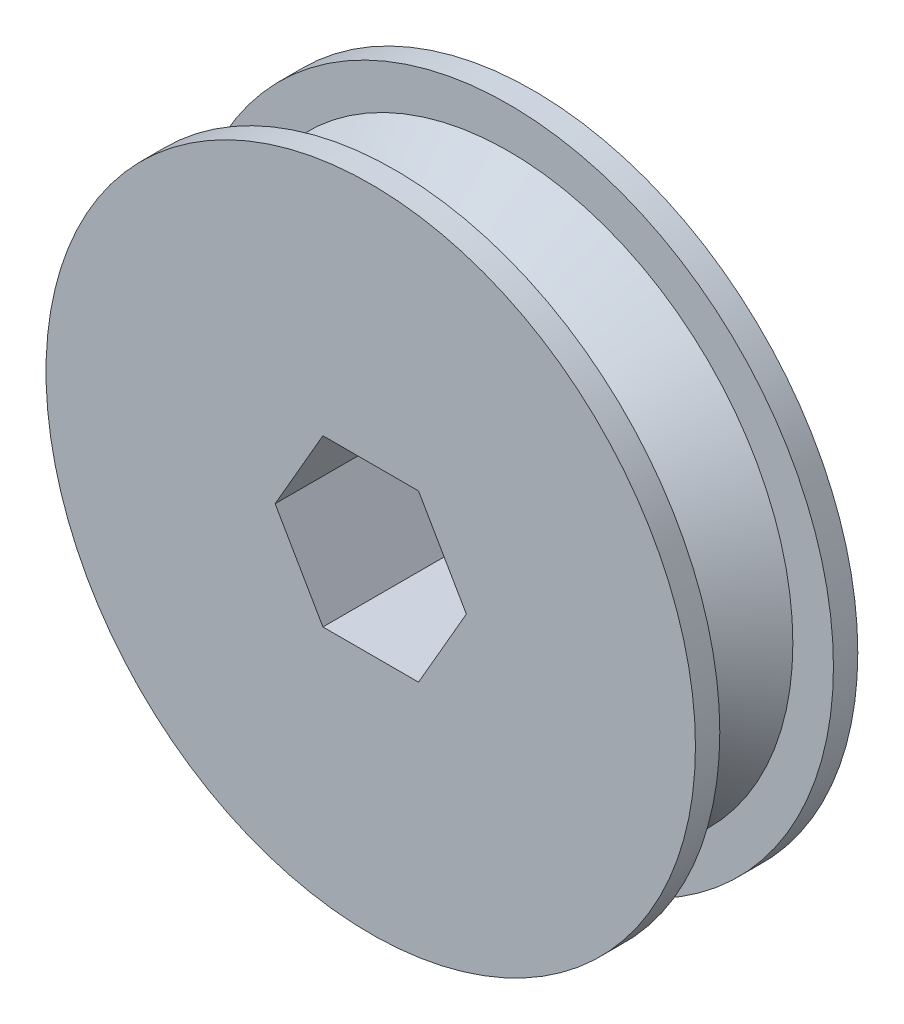
ISO-10303-21;
HEADER;
FILE_DESCRIPTION(('STEP AP214'),'2;1');
FILE_NAME('part.step','',(''),(''),'','','');
FILE_SCHEMA(('AUTOMOTIVE_DESIGN { 1 0 10303 214 1 1 1 1 }'));
ENDSEC;
DATA;
#1=APPLICATION_CONTEXT('core data for automotive mechanical design processes');
#2=APPLICATION_PROTOCOL_DEFINITION('international standard','automotive_design',2000,#1);
#3=PRODUCT_CONTEXT('',#1,'mechanical');
#4=PRODUCT('Part','Part','',(#3));
#5=PRODUCT_RELATED_PRODUCT_CATEGORY('part','',(#4));
#6=PRODUCT_DEFINITION_FORMATION('','',#4);
#7=PRODUCT_DEFINITION_CONTEXT('part definition',#1,'design');
#8=PRODUCT_DEFINITION('design','',#6,#7);
#9=PRODUCT_DEFINITION_SHAPE('','',#8);
#10=(LENGTH_UNIT() NAMED_UNIT(*) SI_UNIT(.MILLI.,.METRE.));
#11=(NAMED_UNIT(*) PLANE_ANGLE_UNIT() SI_UNIT($,.RADIAN.));
#12=(NAMED_UNIT(*) SI_UNIT($,.STERADIAN.) SOLID_ANGLE_UNIT());
#13=UNCERTAINTY_MEASURE_WITH_UNIT(LENGTH_MEASURE(1.E-05),#10,'distance_accuracy_value','');
#14=(GEOMETRIC_REPRESENTATION_CONTEXT(3) GLOBAL_UNCERTAINTY_ASSIGNED_CONTEXT((#13)) GLOBAL_UNIT_ASSIGNED_CONTEXT((#10,
#11,#12)) REPRESENTATION_CONTEXT('',''));
#15=CARTESIAN_POINT('',(0.,0.,0.));
#16=DIRECTION('',(0.,0.,1.));
#17=DIRECTION('',(1.,0.,0.));
#18=AXIS2_PLACEMENT_3D('',#15,#16,#17);
#19=CARTESIAN_POINT('',(0.,0.,6.35));
#20=DIRECTION('',(0.,0.,-1.));
#21=DIRECTION('',(-1.,0.,0.));
#22=AXIS2_PLACEMENT_3D('',#19,#20,#21);
#23=CYLINDRICAL_SURFACE('',#22,25.4);
#24=CARTESIAN_POINT('',(0.,0.,6.35));
#25=DIRECTION('',(0.,0.,1.));
#26=DIRECTION('',(1.,0.,0.));
#27=AXIS2_PLACEMENT_3D('',#24,#25,#26);
#28=CIRCLE('',#27,25.4);
#29=CARTESIAN_POINT('',(25.4,0.,6.35));
#30=VERTEX_POINT('',#29);
#31=EDGE_CURVE('E11',#30,#30,#28,.T.);
#32=ORIENTED_EDGE('',*,*,#31,.F.);
#33=EDGE_LOOP('',(#32));
#34=FACE_BOUND('',#33,.T.);
#35=CARTESIAN_POINT('',(0.,0.,4.445));
#36=DIRECTION('',(0.,0.,1.));
#37=DIRECTION('',(1.,0.,0.));
#38=AXIS2_PLACEMENT_3D('',#35,#36,#37);
#39=CIRCLE('',#38,25.4);
#40=CARTESIAN_POINT('',(25.4,0.,4.445));
#41=VERTEX_POINT('',#40);
#42=EDGE_CURVE('E142',#41,#41,#39,.T.);
#43=ORIENTED_EDGE('',*,*,#42,.T.);
#44=EDGE_LOOP('',(#43));
#45=FACE_BOUND('',#44,.T.);
#46=ADVANCED_FACE('F32',(#34,#45),#23,.T.);
#47=CARTESIAN_POINT('',(0.,0.,6.35));
#48=DIRECTION('',(0.,0.,1.));
#49=DIRECTION('',(1.,0.,0.));
#50=AXIS2_PLACEMENT_3D('',#47,#48,#49);
#51=PLANE('',#50);
#52=DIRECTION('',(-0.499999999999998,0.86602540378444,0.));
#53=VECTOR('',#52,1.);
#54=CARTESIAN_POINT('',(-3.73949769354121,-6.477,6.35));
#55=LINE('',#54,#53);
#56=CARTESIAN_POINT('',(-3.73949769354121,-6.477,6.35));
#57=VERTEX_POINT('',#56);
#58=CARTESIAN_POINT('',(-7.4789953870824,0.,6.35));
#59=VERTEX_POINT('',#58);
#60=EDGE_CURVE('E86',#57,#59,#55,.T.);
#61=ORIENTED_EDGE('',*,*,#60,.T.);
#62=DIRECTION('',(0.499999999999998,0.86602540378444,0.));
#63=VECTOR('',#62,1.);
#64=CARTESIAN_POINT('',(-7.4789953870824,0.,6.35));
#65=LINE('',#64,#63);
#66=CARTESIAN_POINT('',(-3.73949769354121,6.477,6.35));
#67=VERTEX_POINT('',#66);
#68=EDGE_CURVE('E95',#59,#67,#65,.T.);
#69=ORIENTED_EDGE('',*,*,#68,.T.);
#70=DIRECTION('',(1.,0.,0.));
#71=VECTOR('',#70,1.);
#72=CARTESIAN_POINT('',(-3.73949769354122,6.477,6.35));
#73=LINE('',#72,#71);
#74=CARTESIAN_POINT('',(3.73949769354122,6.477,6.35));
#75=VERTEX_POINT('',#74);
#76=EDGE_CURVE('E46',#67,#75,#73,.T.);
#77=ORIENTED_EDGE('',*,*,#76,.T.);
#78=DIRECTION('',(0.499999999999998,-0.86602540378444,0.));
#79=VECTOR('',#78,1.);
#80=CARTESIAN_POINT('',(3.73949769354122,6.477,6.35));
#81=LINE('',#80,#79);
#82=CARTESIAN_POINT('',(7.4789953870824,0.,6.35));
#83=VERTEX_POINT('',#82);
#84=EDGE_CURVE('E110',#75,#83,#81,.T.);
#85=ORIENTED_EDGE('',*,*,#84,.T.);
#86=DIRECTION('',(-0.499999999999998,-0.86602540378444,0.));
#87=VECTOR('',#86,1.);
#88=CARTESIAN_POINT('',(7.4789953870824,0.,6.35));
#89=LINE('',#88,#87);
#90=CARTESIAN_POINT('',(3.73949769354122,-6.477,6.35));
#91=VERTEX_POINT('',#90);
#92=EDGE_CURVE('E113',#83,#91,#89,.T.);
#93=ORIENTED_EDGE('',*,*,#92,.T.);
#94=DIRECTION('',(-1.,0.,0.));
#95=VECTOR('',#94,1.);
#96=CARTESIAN_POINT('',(3.73949769354122,-6.477,6.35));
#97=LINE('',#96,#95);
#98=EDGE_CURVE('E92',#91,#57,#97,.T.);
#99=ORIENTED_EDGE('',*,*,#98,.T.);
#100=EDGE_LOOP('',(#61,#69,#77,#85,#93,#99));
#101=FACE_BOUND('',#100,.T.);
#102=ORIENTED_EDGE('',*,*,#31,.T.);
#103=EDGE_LOOP('',(#102));
#104=FACE_BOUND('',#103,.T.);
#105=ADVANCED_FACE('F99',(#101,#104),#51,.T.);
#106=CARTESIAN_POINT('',(0.,0.,0.));
#107=DIRECTION('',(0.,0.,-1.));
#108=DIRECTION('',(-1.,0.,0.));
#109=AXIS2_PLACEMENT_3D('',#106,#107,#108);
#110=CONICAL_SURFACE('',#109,17.78,0.785398163397449);
#111=CARTESIAN_POINT('',(0.,0.,-4.445));
#112=DIRECTION('',(0.,0.,1.));
#113=DIRECTION('',(1.,0.,0.));
#114=AXIS2_PLACEMENT_3D('',#111,#112,#113);
#115=CIRCLE('',#114,22.225);
#116=CARTESIAN_POINT('',(22.225,0.,-4.445));
#117=VERTEX_POINT('',#116);
#118=EDGE_CURVE('E129',#117,#117,#115,.T.);
#119=ORIENTED_EDGE('',*,*,#118,.T.);
#120=EDGE_LOOP('',(#119));
#121=FACE_BOUND('',#120,.T.);
#122=CARTESIAN_POINT('',(0.,0.,0.));
#123=DIRECTION('',(0.,0.,1.));
#124=DIRECTION('',(1.,0.,0.));
#125=AXIS2_PLACEMENT_3D('',#122,#123,#124);
#126=CIRCLE('',#125,17.78);
#127=CARTESIAN_POINT('',(17.78,0.,0.));
#128=VERTEX_POINT('',#127);
#129=EDGE_CURVE('E148',#128,#128,#126,.T.);
#130=ORIENTED_EDGE('',*,*,#129,.F.);
#131=EDGE_LOOP('',(#130));
#132=FACE_BOUND('',#131,.T.);
#133=ADVANCED_FACE('F175',(#121,#132),#110,.T.);
#134=CARTESIAN_POINT('',(0.,0.,4.445));
#135=DIRECTION('',(0.,0.,1.));
#136=DIRECTION('',(1.,0.,0.));
#137=AXIS2_PLACEMENT_3D('',#134,#135,#136);
#138=CONICAL_SURFACE('',#137,22.225,0.785398163397449);
#139=ORIENTED_EDGE('',*,*,#129,.T.);
#140=EDGE_LOOP('',(#139));
#141=FACE_BOUND('',#140,.T.);
#142=CARTESIAN_POINT('',(0.,0.,4.445));
#143=DIRECTION('',(0.,0.,1.));
#144=DIRECTION('',(1.,0.,0.));
#145=AXIS2_PLACEMENT_3D('',#142,#143,#144);
#146=CIRCLE('',#145,22.225);
#147=CARTESIAN_POINT('',(22.225,0.,4.445));
#148=VERTEX_POINT('',#147);
#149=EDGE_CURVE('E145',#148,#148,#146,.T.);
#150=ORIENTED_EDGE('',*,*,#149,.F.);
#151=EDGE_LOOP('',(#150));
#152=FACE_BOUND('',#151,.T.);
#153=ADVANCED_FACE('F181',(#141,#152),#138,.T.);
#154=CARTESIAN_POINT('',(-22.225,0.,4.445));
#155=DIRECTION('',(0.,0.,-1.));
#156=DIRECTION('',(-1.,0.,0.));
#157=AXIS2_PLACEMENT_3D('',#154,#155,#156);
#158=PLANE('',#157);
#159=ORIENTED_EDGE('',*,*,#149,.T.);
#160=EDGE_LOOP('',(#159));
#161=FACE_BOUND('',#160,.T.);
#162=ORIENTED_EDGE('',*,*,#42,.F.);
#163=EDGE_LOOP('',(#162));
#164=FACE_BOUND('',#163,.T.);
#165=ADVANCED_FACE('F166',(#161,#164),#158,.T.);
#166=CARTESIAN_POINT('',(-22.225,0.,-4.445));
#167=DIRECTION('',(0.,0.,1.));
#168=DIRECTION('',(1.,0.,0.));
#169=AXIS2_PLACEMENT_3D('',#166,#167,#168);
#170=PLANE('',#169);
#171=CARTESIAN_POINT('',(0.,0.,-4.445));
#172=DIRECTION('',(0.,0.,1.));
#173=DIRECTION('',(1.,0.,0.));
#174=AXIS2_PLACEMENT_3D('',#171,#172,#173);
#175=CIRCLE('',#174,25.4);
#176=CARTESIAN_POINT('',(25.4,0.,-4.445));
#177=VERTEX_POINT('',#176);
#178=EDGE_CURVE('E139',#177,#177,#175,.T.);
#179=ORIENTED_EDGE('',*,*,#178,.T.);
#180=EDGE_LOOP('',(#179));
#181=FACE_BOUND('',#180,.T.);
#182=ORIENTED_EDGE('',*,*,#118,.F.);
#183=EDGE_LOOP('',(#182));
#184=FACE_BOUND('',#183,.T.);
#185=ADVANCED_FACE('F160',(#181,#184),#170,.T.);
#186=CARTESIAN_POINT('',(0.,0.,-6.35));
#187=DIRECTION('',(0.,0.,1.));
#188=DIRECTION('',(1.,0.,0.));
#189=AXIS2_PLACEMENT_3D('',#186,#187,#188);
#190=PLANE('',#189);
#191=DIRECTION('',(0.499999999999998,0.86602540378444,0.));
#192=VECTOR('',#191,1.);
#193=CARTESIAN_POINT('',(-7.4789953870824,0.,-6.35));
#194=LINE('',#193,#192);
#195=CARTESIAN_POINT('',(-7.4789953870824,0.,-6.35));
#196=VERTEX_POINT('',#195);
#197=CARTESIAN_POINT('',(-3.73949769354122,6.477,-6.35));
#198=VERTEX_POINT('',#197);
#199=EDGE_CURVE('E117',#196,#198,#194,.T.);
#200=ORIENTED_EDGE('',*,*,#199,.F.);
#201=DIRECTION('',(-0.499999999999998,0.86602540378444,0.));
#202=VECTOR('',#201,1.);
#203=CARTESIAN_POINT('',(-3.73949769354121,-6.477,-6.35));
#204=LINE('',#203,#202);
#205=CARTESIAN_POINT('',(-3.73949769354121,-6.477,-6.35));
#206=VERTEX_POINT('',#205);
#207=EDGE_CURVE('E54',#206,#196,#204,.T.);
#208=ORIENTED_EDGE('',*,*,#207,.F.);
#209=DIRECTION('',(-1.,0.,0.));
#210=VECTOR('',#209,1.);
#211=CARTESIAN_POINT('',(3.73949769354122,-6.477,-6.35));
#212=LINE('',#211,#210);
#213=CARTESIAN_POINT('',(3.73949769354122,-6.477,-6.35));
#214=VERTEX_POINT('',#213);
#215=EDGE_CURVE('E103',#214,#206,#212,.T.);
#216=ORIENTED_EDGE('',*,*,#215,.F.);
#217=DIRECTION('',(-0.499999999999998,-0.86602540378444,0.));
#218=VECTOR('',#217,1.);
#219=CARTESIAN_POINT('',(7.4789953870824,0.,-6.35));
#220=LINE('',#219,#218);
#221=CARTESIAN_POINT('',(7.4789953870824,0.,-6.35));
#222=VERTEX_POINT('',#221);
#223=EDGE_CURVE('E106',#222,#214,#220,.T.);
#224=ORIENTED_EDGE('',*,*,#223,.F.);
#225=DIRECTION('',(0.499999999999998,-0.86602540378444,0.));
#226=VECTOR('',#225,1.);
#227=CARTESIAN_POINT('',(3.73949769354122,6.477,-6.35));
#228=LINE('',#227,#226);
#229=CARTESIAN_POINT('',(3.73949769354122,6.477,-6.35));
#230=VERTEX_POINT('',#229);
#231=EDGE_CURVE('E122',#230,#222,#228,.T.);
#232=ORIENTED_EDGE('',*,*,#231,.F.);
#233=DIRECTION('',(1.,0.,0.));
#234=VECTOR('',#233,1.);
#235=CARTESIAN_POINT('',(-3.73949769354122,6.477,-6.35));
#236=LINE('',#235,#234);
#237=EDGE_CURVE('E119',#198,#230,#236,.T.);
#238=ORIENTED_EDGE('',*,*,#237,.F.);
#239=EDGE_LOOP('',(#200,#208,#216,#224,#232,#238));
#240=FACE_BOUND('',#239,.T.);
#241=CARTESIAN_POINT('',(0.,0.,-6.35));
#242=DIRECTION('',(0.,0.,1.));
#243=DIRECTION('',(1.,0.,0.));
#244=AXIS2_PLACEMENT_3D('',#241,#242,#243);
#245=CIRCLE('',#244,25.4);
#246=CARTESIAN_POINT('',(25.4,0.,-6.35));
#247=VERTEX_POINT('',#246);
#248=EDGE_CURVE('E35',#247,#247,#245,.T.);
#249=ORIENTED_EDGE('',*,*,#248,.F.);
#250=EDGE_LOOP('',(#249));
#251=FACE_BOUND('',#250,.T.);
#252=ADVANCED_FACE('F158',(#240,#251),#190,.F.);
#253=ORIENTED_EDGE('',*,*,#248,.T.);
#254=EDGE_LOOP('',(#253));
#255=FACE_BOUND('',#254,.T.);
#256=ORIENTED_EDGE('',*,*,#178,.F.);
#257=EDGE_LOOP('',(#256));
#258=FACE_BOUND('',#257,.T.);
#259=ADVANCED_FACE('F155',(#255,#258),#23,.T.);
#260=CARTESIAN_POINT('',(-3.73949769354121,-6.477,6.35));
#261=DIRECTION('',(-0.86602540378444,-0.499999999999998,0.));
#262=DIRECTION('',(0.499999999999998,-0.86602540378444,0.));
#263=AXIS2_PLACEMENT_3D('',#260,#261,#262);
#264=PLANE('',#263);
#265=ORIENTED_EDGE('',*,*,#207,.T.);
#266=DIRECTION('',(0.,0.,-1.));
#267=VECTOR('',#266,1.);
#268=CARTESIAN_POINT('',(-7.4789953870824,0.,6.35));
#269=LINE('',#268,#267);
#270=EDGE_CURVE('E82',#59,#196,#269,.T.);
#271=ORIENTED_EDGE('',*,*,#270,.F.);
#272=ORIENTED_EDGE('',*,*,#60,.F.);
#273=DIRECTION('',(0.,0.,-1.));
#274=VECTOR('',#273,1.);
#275=CARTESIAN_POINT('',(-3.73949769354121,-6.477,6.35));
#276=LINE('',#275,#274);
#277=EDGE_CURVE('E127',#57,#206,#276,.T.);
#278=ORIENTED_EDGE('',*,*,#277,.T.);
#279=EDGE_LOOP('',(#265,#271,#272,#278));
#280=FACE_BOUND('',#279,.T.);
#281=ADVANCED_FACE('F84',(#280),#264,.F.);
#282=CARTESIAN_POINT('',(3.73949769354122,-6.477,6.35));
#283=DIRECTION('',(0.,-1.,0.));
#284=DIRECTION('',(0.,0.,-1.));
#285=AXIS2_PLACEMENT_3D('',#282,#283,#284);
#286=PLANE('',#285);
#287=ORIENTED_EDGE('',*,*,#215,.T.);
#288=ORIENTED_EDGE('',*,*,#277,.F.);
#289=ORIENTED_EDGE('',*,*,#98,.F.);
#290=DIRECTION('',(0.,0.,-1.));
#291=VECTOR('',#290,1.);
#292=CARTESIAN_POINT('',(3.73949769354122,-6.477,6.35));
#293=LINE('',#292,#291);
#294=EDGE_CURVE('E130',#91,#214,#293,.T.);
#295=ORIENTED_EDGE('',*,*,#294,.T.);
#296=EDGE_LOOP('',(#287,#288,#289,#295));
#297=FACE_BOUND('',#296,.T.);
#298=ADVANCED_FACE('F237',(#297),#286,.F.);
#299=CARTESIAN_POINT('',(7.4789953870824,0.,6.35));
#300=DIRECTION('',(0.86602540378444,-0.499999999999998,0.));
#301=DIRECTION('',(0.499999999999998,0.86602540378444,0.));
#302=AXIS2_PLACEMENT_3D('',#299,#300,#301);
#303=PLANE('',#302);
#304=ORIENTED_EDGE('',*,*,#223,.T.);
#305=ORIENTED_EDGE('',*,*,#294,.F.);
#306=ORIENTED_EDGE('',*,*,#92,.F.);
#307=DIRECTION('',(0.,0.,-1.));
#308=VECTOR('',#307,1.);
#309=CARTESIAN_POINT('',(7.4789953870824,0.,6.35));
#310=LINE('',#309,#308);
#311=EDGE_CURVE('E132',#83,#222,#310,.T.);
#312=ORIENTED_EDGE('',*,*,#311,.T.);
#313=EDGE_LOOP('',(#304,#305,#306,#312));
#314=FACE_BOUND('',#313,.T.);
#315=ADVANCED_FACE('F245',(#314),#303,.F.);
#316=CARTESIAN_POINT('',(3.73949769354122,6.477,6.35));
#317=DIRECTION('',(0.86602540378444,0.499999999999998,0.));
#318=DIRECTION('',(-0.499999999999998,0.86602540378444,0.));
#319=AXIS2_PLACEMENT_3D('',#316,#317,#318);
#320=PLANE('',#319);
#321=ORIENTED_EDGE('',*,*,#231,.T.);
#322=ORIENTED_EDGE('',*,*,#311,.F.);
#323=ORIENTED_EDGE('',*,*,#84,.F.);
#324=DIRECTION('',(0.,0.,-1.));
#325=VECTOR('',#324,1.);
#326=CARTESIAN_POINT('',(3.73949769354122,6.477,6.35));
#327=LINE('',#326,#325);
#328=EDGE_CURVE('E134',#75,#230,#327,.T.);
#329=ORIENTED_EDGE('',*,*,#328,.T.);
#330=EDGE_LOOP('',(#321,#322,#323,#329));
#331=FACE_BOUND('',#330,.T.);
#332=ADVANCED_FACE('F255',(#331),#320,.F.);
#333=CARTESIAN_POINT('',(-3.73949769354122,6.477,6.35));
#334=DIRECTION('',(0.,1.,0.));
#335=DIRECTION('',(0.,0.,1.));
#336=AXIS2_PLACEMENT_3D('',#333,#334,#335);
#337=PLANE('',#336);
#338=ORIENTED_EDGE('',*,*,#237,.T.);
#339=ORIENTED_EDGE('',*,*,#328,.F.);
#340=ORIENTED_EDGE('',*,*,#76,.F.);
#341=DIRECTION('',(0.,0.,-1.));
#342=VECTOR('',#341,1.);
#343=CARTESIAN_POINT('',(-3.73949769354122,6.477,6.35));
#344=LINE('',#343,#342);
#345=EDGE_CURVE('E91',#67,#198,#344,.T.);
#346=ORIENTED_EDGE('',*,*,#345,.T.);
#347=EDGE_LOOP('',(#338,#339,#340,#346));
#348=FACE_BOUND('',#347,.T.);
#349=ADVANCED_FACE('F265',(#348),#337,.F.);
#350=CARTESIAN_POINT('',(-7.4789953870824,0.,6.35));
#351=DIRECTION('',(-0.86602540378444,0.499999999999998,0.));
#352=DIRECTION('',(-0.499999999999998,-0.86602540378444,0.));
#353=AXIS2_PLACEMENT_3D('',#350,#351,#352);
#354=PLANE('',#353);
#355=ORIENTED_EDGE('',*,*,#199,.T.);
#356=ORIENTED_EDGE('',*,*,#345,.F.);
#357=ORIENTED_EDGE('',*,*,#68,.F.);
#358=ORIENTED_EDGE('',*,*,#270,.T.);
#359=EDGE_LOOP('',(#355,#356,#357,#358));
#360=FACE_BOUND('',#359,.T.);
#361=ADVANCED_FACE('F96',(#360),#354,.F.);
#362=CLOSED_SHELL('',(#46,#105,#133,#153,#165,#185,#252,#259,#281,#298,#315,#332,#349,#361));
#363=MANIFOLD_SOLID_BREP('B2',#362);
#364=ADVANCED_BREP_SHAPE_REPRESENTATION('',(#18,#363),#14);
#365=SHAPE_DEFINITION_REPRESENTATION(#9,#364);
ENDSEC;
END-ISO-10303-21;
